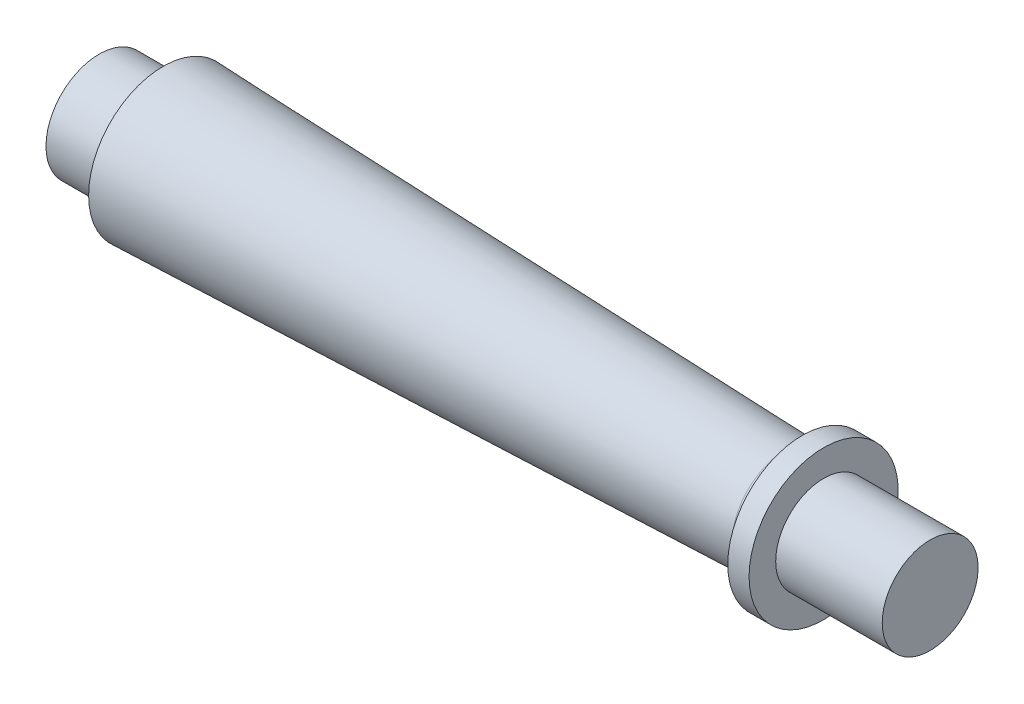
ISO-10303-21;
HEADER;
FILE_DESCRIPTION(('STEP AP214'),'2;1');
FILE_NAME('part.step','',(''),(''),'','','');
FILE_SCHEMA(('AUTOMOTIVE_DESIGN { 1 0 10303 214 1 1 1 1 }'));
ENDSEC;
DATA;
#1=APPLICATION_CONTEXT('core data for automotive mechanical design processes');
#2=APPLICATION_PROTOCOL_DEFINITION('international standard','automotive_design',2000,#1);
#3=PRODUCT_CONTEXT('',#1,'mechanical');
#4=PRODUCT('Part','Part','',(#3));
#5=PRODUCT_RELATED_PRODUCT_CATEGORY('part','',(#4));
#6=PRODUCT_DEFINITION_FORMATION('','',#4);
#7=PRODUCT_DEFINITION_CONTEXT('part definition',#1,'design');
#8=PRODUCT_DEFINITION('design','',#6,#7);
#9=PRODUCT_DEFINITION_SHAPE('','',#8);
#10=(LENGTH_UNIT() NAMED_UNIT(*) SI_UNIT(.MILLI.,.METRE.));
#11=(NAMED_UNIT(*) PLANE_ANGLE_UNIT() SI_UNIT($,.RADIAN.));
#12=(NAMED_UNIT(*) SI_UNIT($,.STERADIAN.) SOLID_ANGLE_UNIT());
#13=UNCERTAINTY_MEASURE_WITH_UNIT(LENGTH_MEASURE(1.E-05),#10,'distance_accuracy_value','');
#14=(GEOMETRIC_REPRESENTATION_CONTEXT(3) GLOBAL_UNCERTAINTY_ASSIGNED_CONTEXT((#13)) GLOBAL_UNIT_ASSIGNED_CONTEXT((#10,
#11,#12)) REPRESENTATION_CONTEXT('',''));
#15=CARTESIAN_POINT('',(0.,0.,0.));
#16=DIRECTION('',(0.,0.,1.));
#17=DIRECTION('',(1.,0.,0.));
#18=AXIS2_PLACEMENT_3D('',#15,#16,#17);
#19=CARTESIAN_POINT('',(0.,5.,0.));
#20=DIRECTION('',(1.,0.,0.));
#21=DIRECTION('',(0.,0.,-1.));
#22=AXIS2_PLACEMENT_3D('',#19,#20,#21);
#23=PLANE('',#22);
#24=CARTESIAN_POINT('',(0.,0.,0.));
#25=DIRECTION('',(-1.,0.,0.));
#26=DIRECTION('',(0.,0.,1.));
#27=AXIS2_PLACEMENT_3D('',#24,#25,#26);
#28=CIRCLE('',#27,5.);
#29=CARTESIAN_POINT('',(0.,0.,5.));
#30=VERTEX_POINT('',#29);
#31=EDGE_CURVE('E76',#30,#30,#28,.T.);
#32=ORIENTED_EDGE('',*,*,#31,.T.);
#33=EDGE_LOOP('',(#32));
#34=FACE_BOUND('',#33,.T.);
#35=ADVANCED_FACE('F43',(#34),#23,.F.);
#36=CARTESIAN_POINT('',(78.,0.,0.));
#37=DIRECTION('',(-1.,0.,0.));
#38=DIRECTION('',(0.,0.,1.));
#39=AXIS2_PLACEMENT_3D('',#36,#37,#38);
#40=PLANE('',#39);
#41=CARTESIAN_POINT('',(78.,0.,0.));
#42=DIRECTION('',(-1.,0.,0.));
#43=DIRECTION('',(0.,0.,1.));
#44=AXIS2_PLACEMENT_3D('',#41,#42,#43);
#45=CIRCLE('',#44,4.49999999999998);
#46=CARTESIAN_POINT('',(78.,0.,4.49999999999998));
#47=VERTEX_POINT('',#46);
#48=EDGE_CURVE('E54',#47,#47,#45,.T.);
#49=ORIENTED_EDGE('',*,*,#48,.F.);
#50=EDGE_LOOP('',(#49));
#51=FACE_BOUND('',#50,.T.);
#52=ADVANCED_FACE('F104',(#51),#40,.F.);
#53=CARTESIAN_POINT('',(0.,0.,0.));
#54=DIRECTION('',(-1.,0.,0.));
#55=DIRECTION('',(0.,0.,1.));
#56=AXIS2_PLACEMENT_3D('',#53,#54,#55);
#57=CYLINDRICAL_SURFACE('',#56,4.49999999999998);
#58=CARTESIAN_POINT('',(68.,0.,0.));
#59=DIRECTION('',(-1.,0.,0.));
#60=DIRECTION('',(0.,0.,1.));
#61=AXIS2_PLACEMENT_3D('',#58,#59,#60);
#62=CIRCLE('',#61,4.49999999999998);
#63=CARTESIAN_POINT('',(68.,0.,4.49999999999998));
#64=VERTEX_POINT('',#63);
#65=EDGE_CURVE('E58',#64,#64,#62,.T.);
#66=ORIENTED_EDGE('',*,*,#65,.F.);
#67=EDGE_LOOP('',(#66));
#68=FACE_BOUND('',#67,.T.);
#69=ORIENTED_EDGE('',*,*,#48,.T.);
#70=EDGE_LOOP('',(#69));
#71=FACE_BOUND('',#70,.T.);
#72=ADVANCED_FACE('F108',(#68,#71),#57,.T.);
#73=CARTESIAN_POINT('',(68.,4.49999999999998,0.));
#74=DIRECTION('',(-1.,0.,0.));
#75=DIRECTION('',(0.,0.,1.));
#76=AXIS2_PLACEMENT_3D('',#73,#74,#75);
#77=PLANE('',#76);
#78=CARTESIAN_POINT('',(68.,0.,0.));
#79=DIRECTION('',(-1.,0.,0.));
#80=DIRECTION('',(0.,0.,1.));
#81=AXIS2_PLACEMENT_3D('',#78,#79,#80);
#82=CIRCLE('',#81,7.);
#83=CARTESIAN_POINT('',(68.,0.,7.));
#84=VERTEX_POINT('',#83);
#85=EDGE_CURVE('E63',#84,#84,#82,.T.);
#86=ORIENTED_EDGE('',*,*,#85,.F.);
#87=EDGE_LOOP('',(#86));
#88=FACE_BOUND('',#87,.T.);
#89=ORIENTED_EDGE('',*,*,#65,.T.);
#90=EDGE_LOOP('',(#89));
#91=FACE_BOUND('',#90,.T.);
#92=ADVANCED_FACE('F114',(#88,#91),#77,.F.);
#93=CARTESIAN_POINT('',(0.,0.,0.));
#94=DIRECTION('',(-1.,0.,0.));
#95=DIRECTION('',(0.,0.,1.));
#96=AXIS2_PLACEMENT_3D('',#93,#94,#95);
#97=CYLINDRICAL_SURFACE('',#96,7.);
#98=CARTESIAN_POINT('',(66.,0.,0.));
#99=DIRECTION('',(-1.,0.,0.));
#100=DIRECTION('',(0.,0.,1.));
#101=AXIS2_PLACEMENT_3D('',#98,#99,#100);
#102=CIRCLE('',#101,7.);
#103=CARTESIAN_POINT('',(66.,0.,7.));
#104=VERTEX_POINT('',#103);
#105=EDGE_CURVE('E66',#104,#104,#102,.T.);
#106=ORIENTED_EDGE('',*,*,#105,.F.);
#107=EDGE_LOOP('',(#106));
#108=FACE_BOUND('',#107,.T.);
#109=ORIENTED_EDGE('',*,*,#85,.T.);
#110=EDGE_LOOP('',(#109));
#111=FACE_BOUND('',#110,.T.);
#112=ADVANCED_FACE('F101',(#108,#111),#97,.T.);
#113=CARTESIAN_POINT('',(66.,7.,0.));
#114=DIRECTION('',(1.,0.,0.));
#115=DIRECTION('',(0.,0.,-1.));
#116=AXIS2_PLACEMENT_3D('',#113,#114,#115);
#117=PLANE('',#116);
#118=CARTESIAN_POINT('',(66.,0.,0.));
#119=DIRECTION('',(1.,0.,0.));
#120=DIRECTION('',(0.,0.,-1.));
#121=AXIS2_PLACEMENT_3D('',#118,#119,#120);
#122=CIRCLE('',#121,6.55083310198036);
#123=CARTESIAN_POINT('',(66.,0.,-6.55083310198036));
#124=VERTEX_POINT('',#123);
#125=EDGE_CURVE('E10',#124,#124,#122,.T.);
#126=ORIENTED_EDGE('',*,*,#125,.T.);
#127=EDGE_LOOP('',(#126));
#128=FACE_BOUND('',#127,.T.);
#129=ORIENTED_EDGE('',*,*,#105,.T.);
#130=EDGE_LOOP('',(#129));
#131=FACE_BOUND('',#130,.T.);
#132=ADVANCED_FACE('F96',(#128,#131),#117,.F.);
#133=CARTESIAN_POINT('',(66.,0.,0.));
#134=DIRECTION('',(-1.,0.,0.));
#135=DIRECTION('',(0.,0.,1.));
#136=AXIS2_PLACEMENT_3D('',#133,#134,#135);
#137=CONICAL_SURFACE('',#136,5.,0.0333209958782472);
#138=CARTESIAN_POINT('',(64.450027754651,0.,0.));
#139=DIRECTION('',(-1.,0.,0.));
#140=DIRECTION('',(0.,0.,1.));
#141=AXIS2_PLACEMENT_3D('',#138,#139,#140);
#142=CIRCLE('',#141,5.05166574151163);
#143=CARTESIAN_POINT('',(64.450027754651,0.,5.05166574151163));
#144=VERTEX_POINT('',#143);
#145=EDGE_CURVE('E50',#144,#144,#142,.T.);
#146=ORIENTED_EDGE('',*,*,#145,.T.);
#147=EDGE_LOOP('',(#146));
#148=FACE_BOUND('',#147,.T.);
#149=CARTESIAN_POINT('',(6.,0.,0.));
#150=DIRECTION('',(-1.,0.,0.));
#151=DIRECTION('',(0.,0.,1.));
#152=AXIS2_PLACEMENT_3D('',#149,#150,#151);
#153=CIRCLE('',#152,7.);
#154=CARTESIAN_POINT('',(6.,0.,7.));
#155=VERTEX_POINT('',#154);
#156=EDGE_CURVE('E69',#155,#155,#153,.T.);
#157=ORIENTED_EDGE('',*,*,#156,.F.);
#158=EDGE_LOOP('',(#157));
#159=FACE_BOUND('',#158,.T.);
#160=ADVANCED_FACE('F91',(#148,#159),#137,.T.);
#161=CARTESIAN_POINT('',(6.,7.,0.));
#162=DIRECTION('',(1.,0.,0.));
#163=DIRECTION('',(0.,0.,-1.));
#164=AXIS2_PLACEMENT_3D('',#161,#162,#163);
#165=PLANE('',#164);
#166=CARTESIAN_POINT('',(6.,0.,0.));
#167=DIRECTION('',(-1.,0.,0.));
#168=DIRECTION('',(0.,0.,1.));
#169=AXIS2_PLACEMENT_3D('',#166,#167,#168);
#170=CIRCLE('',#169,5.);
#171=CARTESIAN_POINT('',(6.,0.,5.));
#172=VERTEX_POINT('',#171);
#173=EDGE_CURVE('E73',#172,#172,#170,.T.);
#174=ORIENTED_EDGE('',*,*,#173,.F.);
#175=EDGE_LOOP('',(#174));
#176=FACE_BOUND('',#175,.T.);
#177=ORIENTED_EDGE('',*,*,#156,.T.);
#178=EDGE_LOOP('',(#177));
#179=FACE_BOUND('',#178,.T.);
#180=ADVANCED_FACE('F85',(#176,#179),#165,.F.);
#181=CARTESIAN_POINT('',(0.,0.,0.));
#182=DIRECTION('',(-1.,0.,0.));
#183=DIRECTION('',(0.,0.,1.));
#184=AXIS2_PLACEMENT_3D('',#181,#182,#183);
#185=CYLINDRICAL_SURFACE('',#184,5.);
#186=ORIENTED_EDGE('',*,*,#31,.F.);
#187=EDGE_LOOP('',(#186));
#188=FACE_BOUND('',#187,.T.);
#189=ORIENTED_EDGE('',*,*,#173,.T.);
#190=EDGE_LOOP('',(#189));
#191=FACE_BOUND('',#190,.T.);
#192=ADVANCED_FACE('F82',(#188,#191),#185,.T.);
#193=CARTESIAN_POINT('',(64.5,0.,0.));
#194=DIRECTION('',(1.,0.,0.));
#195=DIRECTION('',(0.,0.,-1.));
#196=AXIS2_PLACEMENT_3D('',#193,#194,#195);
#197=TOROIDAL_SURFACE('',#196,6.55083310198036,1.5);
#198=ORIENTED_EDGE('',*,*,#125,.F.);
#199=EDGE_LOOP('',(#198));
#200=FACE_BOUND('',#199,.T.);
#201=ORIENTED_EDGE('',*,*,#145,.F.);
#202=EDGE_LOOP('',(#201));
#203=FACE_BOUND('',#202,.T.);
#204=ADVANCED_FACE('F45',(#200,#203),#197,.F.);
#205=CLOSED_SHELL('',(#35,#52,#72,#92,#112,#132,#160,#180,#192,#204));
#206=MANIFOLD_SOLID_BREP('B2',#205);
#207=ADVANCED_BREP_SHAPE_REPRESENTATION('',(#18,#206),#14);
#208=SHAPE_DEFINITION_REPRESENTATION(#9,#207);
ENDSEC;
END-ISO-10303-21;
